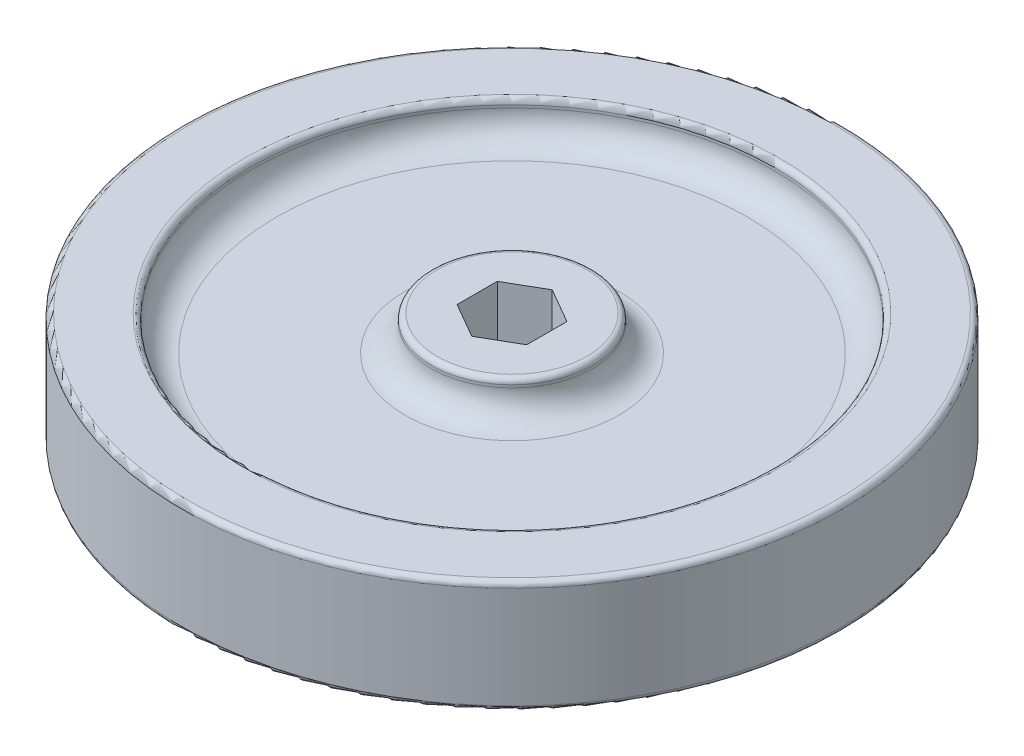
ISO-10303-21;
HEADER;
FILE_DESCRIPTION(('STEP AP214'),'2;1');
FILE_NAME('part.step','',(''),(''),'','','');
FILE_SCHEMA(('AUTOMOTIVE_DESIGN { 1 0 10303 214 1 1 1 1 }'));
ENDSEC;
DATA;
#1=APPLICATION_CONTEXT('core data for automotive mechanical design processes');
#2=APPLICATION_PROTOCOL_DEFINITION('international standard','automotive_design',2000,#1);
#3=PRODUCT_CONTEXT('',#1,'mechanical');
#4=PRODUCT('Part','Part','',(#3));
#5=PRODUCT_RELATED_PRODUCT_CATEGORY('part','',(#4));
#6=PRODUCT_DEFINITION_FORMATION('','',#4);
#7=PRODUCT_DEFINITION_CONTEXT('part definition',#1,'design');
#8=PRODUCT_DEFINITION('design','',#6,#7);
#9=PRODUCT_DEFINITION_SHAPE('','',#8);
#10=(LENGTH_UNIT() NAMED_UNIT(*) SI_UNIT(.MILLI.,.METRE.));
#11=(NAMED_UNIT(*) PLANE_ANGLE_UNIT() SI_UNIT($,.RADIAN.));
#12=(NAMED_UNIT(*) SI_UNIT($,.STERADIAN.) SOLID_ANGLE_UNIT());
#13=UNCERTAINTY_MEASURE_WITH_UNIT(LENGTH_MEASURE(1.E-05),#10,'distance_accuracy_value','');
#14=(GEOMETRIC_REPRESENTATION_CONTEXT(3) GLOBAL_UNCERTAINTY_ASSIGNED_CONTEXT((#13)) GLOBAL_UNIT_ASSIGNED_CONTEXT((#10,
#11,#12)) REPRESENTATION_CONTEXT('',''));
#15=CARTESIAN_POINT('',(0.,0.,0.));
#16=DIRECTION('',(0.,0.,1.));
#17=DIRECTION('',(1.,0.,0.));
#18=AXIS2_PLACEMENT_3D('',#15,#16,#17);
#19=CARTESIAN_POINT('',(0.,0.,0.));
#20=DIRECTION('',(0.,-1.,0.));
#21=DIRECTION('',(1.,0.,0.));
#22=AXIS2_PLACEMENT_3D('',#19,#20,#21);
#23=PLANE('',#22);
#24=CARTESIAN_POINT('',(0.,0.,0.));
#25=DIRECTION('',(0.,-1.,0.));
#26=DIRECTION('',(1.,0.,0.));
#27=AXIS2_PLACEMENT_3D('',#24,#25,#26);
#28=CIRCLE('',#27,13.9999999999999);
#29=CARTESIAN_POINT('',(13.9999999999999,0.,0.));
#30=VERTEX_POINT('',#29);
#31=EDGE_CURVE('E200',#30,#30,#28,.T.);
#32=ORIENTED_EDGE('',*,*,#31,.T.);
#33=EDGE_LOOP('',(#32));
#34=FACE_BOUND('',#33,.T.);
#35=DIRECTION('',(-0.866025403784439,0.,-0.5));
#36=VECTOR('',#35,1.);
#37=CARTESIAN_POINT('',(6.5,-2.42861286636753E-13,-3.75277674973257));
#38=LINE('',#37,#36);
#39=CARTESIAN_POINT('',(6.5,-2.42861286636753E-13,-3.75277674973257));
#40=VERTEX_POINT('',#39);
#41=CARTESIAN_POINT('',(0.,-2.63677968348475E-13,-7.50555349946514));
#42=VERTEX_POINT('',#41);
#43=EDGE_CURVE('E101',#40,#42,#38,.T.);
#44=ORIENTED_EDGE('',*,*,#43,.T.);
#45=DIRECTION('',(-0.866025403784439,0.,0.5));
#46=VECTOR('',#45,1.);
#47=CARTESIAN_POINT('',(0.,-2.63677968348475E-13,-7.50555349946514));
#48=LINE('',#47,#46);
#49=CARTESIAN_POINT('',(-6.50000000000007,0.,-3.75277674973252));
#50=VERTEX_POINT('',#49);
#51=EDGE_CURVE('E112',#42,#50,#48,.T.);
#52=ORIENTED_EDGE('',*,*,#51,.T.);
#53=DIRECTION('',(0.,0.,1.));
#54=VECTOR('',#53,1.);
#55=CARTESIAN_POINT('',(-6.5,-2.84494650060196E-13,-3.75277674973257));
#56=LINE('',#55,#54);
#57=CARTESIAN_POINT('',(-6.5,-2.84494650060196E-13,3.75277674973257));
#58=VERTEX_POINT('',#57);
#59=EDGE_CURVE('E63',#50,#58,#56,.T.);
#60=ORIENTED_EDGE('',*,*,#59,.T.);
#61=DIRECTION('',(0.866025403784439,0.,0.5));
#62=VECTOR('',#61,1.);
#63=CARTESIAN_POINT('',(-6.5,-2.84494650060196E-13,3.75277674973257));
#64=LINE('',#63,#62);
#65=CARTESIAN_POINT('',(0.,-2.63677968348475E-13,7.50555349946513));
#66=VERTEX_POINT('',#65);
#67=EDGE_CURVE('E126',#58,#66,#64,.T.);
#68=ORIENTED_EDGE('',*,*,#67,.T.);
#69=DIRECTION('',(0.866025403784439,0.,-0.5));
#70=VECTOR('',#69,1.);
#71=CARTESIAN_POINT('',(0.,-2.63677968348475E-13,7.50555349946513));
#72=LINE('',#71,#70);
#73=CARTESIAN_POINT('',(6.5,-2.42861286636753E-13,3.75277674973257));
#74=VERTEX_POINT('',#73);
#75=EDGE_CURVE('E135',#66,#74,#72,.T.);
#76=ORIENTED_EDGE('',*,*,#75,.T.);
#77=DIRECTION('',(0.,0.,-1.));
#78=VECTOR('',#77,1.);
#79=CARTESIAN_POINT('',(6.5,-2.42861286636753E-13,3.75277674973257));
#80=LINE('',#79,#78);
#81=EDGE_CURVE('E107',#74,#40,#80,.T.);
#82=ORIENTED_EDGE('',*,*,#81,.T.);
#83=EDGE_LOOP('',(#44,#52,#60,#68,#76,#82));
#84=FACE_BOUND('',#83,.T.);
#85=ADVANCED_FACE('F44',(#34,#84),#23,.T.);
#86=CARTESIAN_POINT('',(1.9035519623152E-12,-554.931132676819,0.));
#87=DIRECTION('',(0.,-1.,0.));
#88=DIRECTION('',(1.,0.,0.));
#89=AXIS2_PLACEMENT_3D('',#86,#87,#88);
#90=CYLINDRICAL_SURFACE('',#89,14.9999999999999);
#91=CARTESIAN_POINT('',(0.,1.49999999999995,0.));
#92=DIRECTION('',(0.,-1.,0.));
#93=DIRECTION('',(1.,0.,0.));
#94=AXIS2_PLACEMENT_3D('',#91,#92,#93);
#95=CIRCLE('',#94,14.9999999999999);
#96=CARTESIAN_POINT('',(14.9999999999999,1.5,0.));
#97=VERTEX_POINT('',#96);
#98=EDGE_CURVE('E230',#97,#97,#95,.T.);
#99=ORIENTED_EDGE('',*,*,#98,.T.);
#100=EDGE_LOOP('',(#99));
#101=FACE_BOUND('',#100,.T.);
#102=CARTESIAN_POINT('',(0.,1.,0.));
#103=DIRECTION('',(0.,-1.,0.));
#104=DIRECTION('',(1.,0.,0.));
#105=AXIS2_PLACEMENT_3D('',#102,#103,#104);
#106=CIRCLE('',#105,14.9999999999999);
#107=CARTESIAN_POINT('',(14.9999999999999,1.00000000000005,0.));
#108=VERTEX_POINT('',#107);
#109=EDGE_CURVE('E201',#108,#108,#106,.F.);
#110=ORIENTED_EDGE('',*,*,#109,.T.);
#111=EDGE_LOOP('',(#110));
#112=FACE_BOUND('',#111,.T.);
#113=ADVANCED_FACE('F289',(#101,#112),#90,.T.);
#114=CARTESIAN_POINT('',(14.9999999999999,6.49999999999994,0.));
#115=DIRECTION('',(0.,-1.,0.));
#116=DIRECTION('',(1.,0.,0.));
#117=AXIS2_PLACEMENT_3D('',#114,#115,#116);
#118=PLANE('',#117);
#119=CARTESIAN_POINT('',(0.,6.49999999999989,0.));
#120=DIRECTION('',(0.,-1.,0.));
#121=DIRECTION('',(1.,0.,0.));
#122=AXIS2_PLACEMENT_3D('',#119,#120,#121);
#123=CIRCLE('',#122,44.);
#124=CARTESIAN_POINT('',(44.,6.50000000000004,0.));
#125=VERTEX_POINT('',#124);
#126=EDGE_CURVE('E218',#125,#125,#123,.T.);
#127=ORIENTED_EDGE('',*,*,#126,.T.);
#128=EDGE_LOOP('',(#127));
#129=FACE_BOUND('',#128,.T.);
#130=CARTESIAN_POINT('',(0.,6.49999999999989,0.));
#131=DIRECTION('',(0.,-1.,0.));
#132=DIRECTION('',(1.,0.,0.));
#133=AXIS2_PLACEMENT_3D('',#130,#131,#132);
#134=CIRCLE('',#133,19.9999999999999);
#135=CARTESIAN_POINT('',(19.9999999999999,6.49999999999996,0.));
#136=VERTEX_POINT('',#135);
#137=EDGE_CURVE('E214',#136,#136,#134,.F.);
#138=ORIENTED_EDGE('',*,*,#137,.T.);
#139=EDGE_LOOP('',(#138));
#140=FACE_BOUND('',#139,.T.);
#141=ADVANCED_FACE('F300',(#129,#140),#118,.T.);
#142=CARTESIAN_POINT('',(1.9035519623152E-12,-554.931132676819,0.));
#143=DIRECTION('',(0.,-1.,0.));
#144=DIRECTION('',(1.,0.,0.));
#145=AXIS2_PLACEMENT_3D('',#142,#143,#144);
#146=CYLINDRICAL_SURFACE('',#145,49.);
#147=CARTESIAN_POINT('',(0.,1.49999999999995,0.));
#148=DIRECTION('',(0.,-1.,0.));
#149=DIRECTION('',(1.,0.,0.));
#150=AXIS2_PLACEMENT_3D('',#147,#148,#149);
#151=CIRCLE('',#150,49.);
#152=CARTESIAN_POINT('',(49.,1.50000000000011,0.));
#153=VERTEX_POINT('',#152);
#154=EDGE_CURVE('E224',#153,#153,#151,.F.);
#155=ORIENTED_EDGE('',*,*,#154,.T.);
#156=EDGE_LOOP('',(#155));
#157=FACE_BOUND('',#156,.T.);
#158=CARTESIAN_POINT('',(0.,0.999999999999779,0.));
#159=DIRECTION('',(0.,-1.,0.));
#160=DIRECTION('',(1.,0.,0.));
#161=AXIS2_PLACEMENT_3D('',#158,#159,#160);
#162=CIRCLE('',#161,49.);
#163=CARTESIAN_POINT('',(49.,0.999999999999947,0.));
#164=VERTEX_POINT('',#163);
#165=EDGE_CURVE('E177',#164,#164,#162,.T.);
#166=ORIENTED_EDGE('',*,*,#165,.T.);
#167=EDGE_LOOP('',(#166));
#168=FACE_BOUND('',#167,.T.);
#169=ADVANCED_FACE('F286',(#157,#168),#146,.F.);
#170=CARTESIAN_POINT('',(49.,0.,0.));
#171=DIRECTION('',(0.,-1.,0.));
#172=DIRECTION('',(1.,0.,0.));
#173=AXIS2_PLACEMENT_3D('',#170,#171,#172);
#174=PLANE('',#173);
#175=CARTESIAN_POINT('',(0.,-1.89518539750466E-13,0.));
#176=DIRECTION('',(0.,-1.,0.));
#177=DIRECTION('',(1.,0.,0.));
#178=AXIS2_PLACEMENT_3D('',#175,#176,#177);
#179=CIRCLE('',#178,50.);
#180=CARTESIAN_POINT('',(50.,0.,0.));
#181=VERTEX_POINT('',#180);
#182=EDGE_CURVE('E190',#181,#181,#179,.F.);
#183=ORIENTED_EDGE('',*,*,#182,.T.);
#184=EDGE_LOOP('',(#183));
#185=FACE_BOUND('',#184,.T.);
#186=CARTESIAN_POINT('',(0.,-1.89518539750466E-13,0.));
#187=DIRECTION('',(0.,-1.,0.));
#188=DIRECTION('',(1.,0.,0.));
#189=AXIS2_PLACEMENT_3D('',#186,#187,#188);
#190=CIRCLE('',#189,60.5);
#191=CARTESIAN_POINT('',(60.5,0.,0.));
#192=VERTEX_POINT('',#191);
#193=EDGE_CURVE('E181',#192,#192,#190,.T.);
#194=ORIENTED_EDGE('',*,*,#193,.T.);
#195=EDGE_LOOP('',(#194));
#196=FACE_BOUND('',#195,.T.);
#197=ADVANCED_FACE('F278',(#185,#196),#174,.T.);
#198=CARTESIAN_POINT('',(1.9035519623152E-12,-554.931132676819,0.));
#199=DIRECTION('',(0.,-1.,0.));
#200=DIRECTION('',(1.,0.,0.));
#201=AXIS2_PLACEMENT_3D('',#198,#199,#200);
#202=CYLINDRICAL_SURFACE('',#201,61.5);
#203=CARTESIAN_POINT('',(0.,0.999999999999779,0.));
#204=DIRECTION('',(0.,-1.,0.));
#205=DIRECTION('',(1.,0.,0.));
#206=AXIS2_PLACEMENT_3D('',#203,#204,#205);
#207=CIRCLE('',#206,61.5);
#208=CARTESIAN_POINT('',(61.5,0.99999999999999,0.));
#209=VERTEX_POINT('',#208);
#210=EDGE_CURVE('E194',#209,#209,#207,.F.);
#211=ORIENTED_EDGE('',*,*,#210,.T.);
#212=EDGE_LOOP('',(#211));
#213=FACE_BOUND('',#212,.T.);
#214=CARTESIAN_POINT('',(0.,19.9999999999998,0.));
#215=DIRECTION('',(0.,1.,0.));
#216=DIRECTION('',(-1.,0.,0.));
#217=AXIS2_PLACEMENT_3D('',#214,#215,#216);
#218=CIRCLE('',#217,61.5);
#219=CARTESIAN_POINT('',(-61.5000000000001,19.9999999999996,0.));
#220=VERTEX_POINT('',#219);
#221=EDGE_CURVE('E191',#220,#220,#218,.F.);
#222=ORIENTED_EDGE('',*,*,#221,.T.);
#223=EDGE_LOOP('',(#222));
#224=FACE_BOUND('',#223,.T.);
#225=ADVANCED_FACE('F270',(#213,#224),#202,.T.);
#226=CARTESIAN_POINT('',(61.5,21.,0.));
#227=DIRECTION('',(0.,1.,0.));
#228=DIRECTION('',(-1.,0.,0.));
#229=AXIS2_PLACEMENT_3D('',#226,#227,#228);
#230=PLANE('',#229);
#231=CARTESIAN_POINT('',(0.,20.9999999999998,0.));
#232=DIRECTION('',(0.,1.,0.));
#233=DIRECTION('',(-1.,0.,0.));
#234=AXIS2_PLACEMENT_3D('',#231,#232,#233);
#235=CIRCLE('',#234,50.0000000000001);
#236=CARTESIAN_POINT('',(-50.0000000000001,20.9999999999996,0.));
#237=VERTEX_POINT('',#236);
#238=EDGE_CURVE('E173',#237,#237,#235,.F.);
#239=ORIENTED_EDGE('',*,*,#238,.T.);
#240=EDGE_LOOP('',(#239));
#241=FACE_BOUND('',#240,.T.);
#242=CARTESIAN_POINT('',(0.,20.9999999999998,0.));
#243=DIRECTION('',(0.,1.,0.));
#244=DIRECTION('',(-1.,0.,0.));
#245=AXIS2_PLACEMENT_3D('',#242,#243,#244);
#246=CIRCLE('',#245,60.5);
#247=CARTESIAN_POINT('',(-60.5000000000001,20.9999999999996,0.));
#248=VERTEX_POINT('',#247);
#249=EDGE_CURVE('E156',#248,#248,#246,.T.);
#250=ORIENTED_EDGE('',*,*,#249,.T.);
#251=EDGE_LOOP('',(#250));
#252=FACE_BOUND('',#251,.T.);
#253=ADVANCED_FACE('F255',(#241,#252),#230,.T.);
#254=CARTESIAN_POINT('',(1.9035519623152E-12,-554.931132676819,0.));
#255=DIRECTION('',(0.,-1.,0.));
#256=DIRECTION('',(1.,0.,0.));
#257=AXIS2_PLACEMENT_3D('',#254,#255,#256);
#258=CYLINDRICAL_SURFACE('',#257,49.0000000000001);
#259=CARTESIAN_POINT('',(0.,19.4999999999997,0.));
#260=DIRECTION('',(0.,1.,0.));
#261=DIRECTION('',(-1.,0.,0.));
#262=AXIS2_PLACEMENT_3D('',#259,#260,#261);
#263=CIRCLE('',#262,49.0000000000001);
#264=CARTESIAN_POINT('',(-49.0000000000001,19.4999999999996,0.));
#265=VERTEX_POINT('',#264);
#266=EDGE_CURVE('E231',#265,#265,#263,.F.);
#267=ORIENTED_EDGE('',*,*,#266,.T.);
#268=EDGE_LOOP('',(#267));
#269=FACE_BOUND('',#268,.T.);
#270=CARTESIAN_POINT('',(0.,19.9999999999997,0.));
#271=DIRECTION('',(0.,1.,0.));
#272=DIRECTION('',(-1.,0.,0.));
#273=AXIS2_PLACEMENT_3D('',#270,#271,#272);
#274=CIRCLE('',#273,49.0000000000001);
#275=CARTESIAN_POINT('',(-49.0000000000001,19.9999999999995,0.));
#276=VERTEX_POINT('',#275);
#277=EDGE_CURVE('E172',#276,#276,#274,.T.);
#278=ORIENTED_EDGE('',*,*,#277,.T.);
#279=EDGE_LOOP('',(#278));
#280=FACE_BOUND('',#279,.T.);
#281=ADVANCED_FACE('F253',(#269,#280),#258,.F.);
#282=CARTESIAN_POINT('',(49.,14.5000000000001,0.));
#283=DIRECTION('',(0.,1.,0.));
#284=DIRECTION('',(-1.,0.,0.));
#285=AXIS2_PLACEMENT_3D('',#282,#283,#284);
#286=PLANE('',#285);
#287=CARTESIAN_POINT('',(0.,14.4999999999999,0.));
#288=DIRECTION('',(0.,1.,0.));
#289=DIRECTION('',(-1.,0.,0.));
#290=AXIS2_PLACEMENT_3D('',#287,#288,#289);
#291=CIRCLE('',#290,44.0000000000001);
#292=CARTESIAN_POINT('',(-44.0000000000001,14.4999999999997,0.));
#293=VERTEX_POINT('',#292);
#294=EDGE_CURVE('E53',#293,#293,#291,.T.);
#295=ORIENTED_EDGE('',*,*,#294,.T.);
#296=EDGE_LOOP('',(#295));
#297=FACE_BOUND('',#296,.T.);
#298=CARTESIAN_POINT('',(0.,14.4999999999999,0.));
#299=DIRECTION('',(0.,1.,0.));
#300=DIRECTION('',(-1.,0.,0.));
#301=AXIS2_PLACEMENT_3D('',#298,#299,#300);
#302=CIRCLE('',#301,20.0000000000001);
#303=CARTESIAN_POINT('',(-20.0000000000001,14.4999999999998,0.));
#304=VERTEX_POINT('',#303);
#305=EDGE_CURVE('E234',#304,#304,#302,.F.);
#306=ORIENTED_EDGE('',*,*,#305,.T.);
#307=EDGE_LOOP('',(#306));
#308=FACE_BOUND('',#307,.T.);
#309=ADVANCED_FACE('F245',(#297,#308),#286,.T.);
#310=CARTESIAN_POINT('',(1.9035519623152E-12,-554.931132676819,0.));
#311=DIRECTION('',(0.,-1.,0.));
#312=DIRECTION('',(1.,0.,0.));
#313=AXIS2_PLACEMENT_3D('',#310,#311,#312);
#314=CYLINDRICAL_SURFACE('',#313,15.0000000000001);
#315=CARTESIAN_POINT('',(0.,19.4999999999999,0.));
#316=DIRECTION('',(0.,1.,0.));
#317=DIRECTION('',(-1.,0.,0.));
#318=AXIS2_PLACEMENT_3D('',#315,#316,#317);
#319=CIRCLE('',#318,15.0000000000001);
#320=CARTESIAN_POINT('',(-15.0000000000001,19.4999999999998,0.));
#321=VERTEX_POINT('',#320);
#322=EDGE_CURVE('E11',#321,#321,#319,.T.);
#323=ORIENTED_EDGE('',*,*,#322,.T.);
#324=EDGE_LOOP('',(#323));
#325=FACE_BOUND('',#324,.T.);
#326=CARTESIAN_POINT('',(0.,20.,0.));
#327=DIRECTION('',(0.,1.,0.));
#328=DIRECTION('',(-1.,0.,0.));
#329=AXIS2_PLACEMENT_3D('',#326,#327,#328);
#330=CIRCLE('',#329,15.0000000000001);
#331=CARTESIAN_POINT('',(-15.0000000000001,20.,0.));
#332=VERTEX_POINT('',#331);
#333=EDGE_CURVE('E210',#332,#332,#330,.F.);
#334=ORIENTED_EDGE('',*,*,#333,.T.);
#335=EDGE_LOOP('',(#334));
#336=FACE_BOUND('',#335,.T.);
#337=ADVANCED_FACE('F359',(#325,#336),#314,.T.);
#338=CARTESIAN_POINT('',(15.,21.,0.));
#339=DIRECTION('',(0.,1.,0.));
#340=DIRECTION('',(-1.,0.,0.));
#341=AXIS2_PLACEMENT_3D('',#338,#339,#340);
#342=PLANE('',#341);
#343=CARTESIAN_POINT('',(0.,21.,0.));
#344=DIRECTION('',(0.,1.,0.));
#345=DIRECTION('',(-1.,0.,0.));
#346=AXIS2_PLACEMENT_3D('',#343,#344,#345);
#347=CIRCLE('',#346,14.0000000000001);
#348=CARTESIAN_POINT('',(-14.0000000000001,20.9999999999999,0.));
#349=VERTEX_POINT('',#348);
#350=EDGE_CURVE('E211',#349,#349,#347,.T.);
#351=ORIENTED_EDGE('',*,*,#350,.T.);
#352=EDGE_LOOP('',(#351));
#353=FACE_BOUND('',#352,.T.);
#354=DIRECTION('',(-0.866025403784439,0.,-0.5));
#355=VECTOR('',#354,1.);
#356=CARTESIAN_POINT('',(6.49999999999993,21.,-3.75277674973257));
#357=LINE('',#356,#355);
#358=CARTESIAN_POINT('',(6.49999999999993,21.,-3.75277674973257));
#359=VERTEX_POINT('',#358);
#360=CARTESIAN_POINT('',(0.,21.,-7.50555349946518));
#361=VERTEX_POINT('',#360);
#362=EDGE_CURVE('E67',#359,#361,#357,.T.);
#363=ORIENTED_EDGE('',*,*,#362,.F.);
#364=DIRECTION('',(0.,0.,-1.));
#365=VECTOR('',#364,1.);
#366=CARTESIAN_POINT('',(6.49999999999993,21.,3.75277674973257));
#367=LINE('',#366,#365);
#368=CARTESIAN_POINT('',(6.49999999999993,21.,3.75277674973257));
#369=VERTEX_POINT('',#368);
#370=EDGE_CURVE('E119',#369,#359,#367,.T.);
#371=ORIENTED_EDGE('',*,*,#370,.F.);
#372=DIRECTION('',(0.866025403784439,0.,-0.5));
#373=VECTOR('',#372,1.);
#374=CARTESIAN_POINT('',(0.,21.,7.50555349946513));
#375=LINE('',#374,#373);
#376=CARTESIAN_POINT('',(0.,21.,7.50555349946513));
#377=VERTEX_POINT('',#376);
#378=EDGE_CURVE('E123',#377,#369,#375,.T.);
#379=ORIENTED_EDGE('',*,*,#378,.F.);
#380=DIRECTION('',(0.866025403784439,0.,0.5));
#381=VECTOR('',#380,1.);
#382=CARTESIAN_POINT('',(-6.50000000000007,21.,3.75277674973257));
#383=LINE('',#382,#381);
#384=CARTESIAN_POINT('',(-6.50000000000007,21.,3.75277674973257));
#385=VERTEX_POINT('',#384);
#386=EDGE_CURVE('E148',#385,#377,#383,.T.);
#387=ORIENTED_EDGE('',*,*,#386,.F.);
#388=DIRECTION('',(0.,0.,1.));
#389=VECTOR('',#388,1.);
#390=CARTESIAN_POINT('',(-6.50000000000007,21.,-3.75277674973257));
#391=LINE('',#390,#389);
#392=CARTESIAN_POINT('',(-6.50000000000007,21.,-3.75277674973257));
#393=VERTEX_POINT('',#392);
#394=EDGE_CURVE('E142',#393,#385,#391,.T.);
#395=ORIENTED_EDGE('',*,*,#394,.F.);
#396=DIRECTION('',(-0.866025403784439,0.,0.5));
#397=VECTOR('',#396,1.);
#398=CARTESIAN_POINT('',(0.,21.,-7.50555349946514));
#399=LINE('',#398,#397);
#400=EDGE_CURVE('E137',#361,#393,#399,.T.);
#401=ORIENTED_EDGE('',*,*,#400,.F.);
#402=EDGE_LOOP('',(#363,#371,#379,#387,#395,#401));
#403=FACE_BOUND('',#402,.T.);
#404=ADVANCED_FACE('F370',(#353,#403),#342,.T.);
#405=CARTESIAN_POINT('',(6.5,-2.42861286636753E-13,-3.75277674973257));
#406=DIRECTION('',(0.5,0.,-0.866025403784439));
#407=DIRECTION('',(-0.866025403784439,0.,-0.5));
#408=AXIS2_PLACEMENT_3D('',#405,#406,#407);
#409=PLANE('',#408);
#410=ORIENTED_EDGE('',*,*,#362,.T.);
#411=DIRECTION('',(0.,1.,0.));
#412=VECTOR('',#411,1.);
#413=CARTESIAN_POINT('',(0.,-2.63677968348475E-13,-7.50555349946514));
#414=LINE('',#413,#412);
#415=EDGE_CURVE('E100',#42,#361,#414,.T.);
#416=ORIENTED_EDGE('',*,*,#415,.F.);
#417=ORIENTED_EDGE('',*,*,#43,.F.);
#418=DIRECTION('',(0.,1.,0.));
#419=VECTOR('',#418,1.);
#420=CARTESIAN_POINT('',(6.5,-2.42861286636753E-13,-3.75277674973257));
#421=LINE('',#420,#419);
#422=EDGE_CURVE('E153',#40,#359,#421,.T.);
#423=ORIENTED_EDGE('',*,*,#422,.T.);
#424=EDGE_LOOP('',(#410,#416,#417,#423));
#425=FACE_BOUND('',#424,.T.);
#426=ADVANCED_FACE('F97',(#425),#409,.F.);
#427=CARTESIAN_POINT('',(6.5,-2.42861286636753E-13,3.75277674973257));
#428=DIRECTION('',(1.,0.,0.));
#429=DIRECTION('',(0.,1.,0.));
#430=AXIS2_PLACEMENT_3D('',#427,#428,#429);
#431=PLANE('',#430);
#432=ORIENTED_EDGE('',*,*,#370,.T.);
#433=ORIENTED_EDGE('',*,*,#422,.F.);
#434=ORIENTED_EDGE('',*,*,#81,.F.);
#435=DIRECTION('',(0.,1.,0.));
#436=VECTOR('',#435,1.);
#437=CARTESIAN_POINT('',(6.5,-2.42861286636753E-13,3.75277674973257));
#438=LINE('',#437,#436);
#439=EDGE_CURVE('E160',#74,#369,#438,.T.);
#440=ORIENTED_EDGE('',*,*,#439,.T.);
#441=EDGE_LOOP('',(#432,#433,#434,#440));
#442=FACE_BOUND('',#441,.T.);
#443=ADVANCED_FACE('F475',(#442),#431,.F.);
#444=CARTESIAN_POINT('',(0.,-2.63677968348475E-13,7.50555349946513));
#445=DIRECTION('',(0.5,0.,0.866025403784439));
#446=DIRECTION('',(0.866025403784439,0.,-0.5));
#447=AXIS2_PLACEMENT_3D('',#444,#445,#446);
#448=PLANE('',#447);
#449=ORIENTED_EDGE('',*,*,#378,.T.);
#450=ORIENTED_EDGE('',*,*,#439,.F.);
#451=ORIENTED_EDGE('',*,*,#75,.F.);
#452=DIRECTION('',(0.,1.,0.));
#453=VECTOR('',#452,1.);
#454=CARTESIAN_POINT('',(0.,-2.63677968348475E-13,7.50555349946513));
#455=LINE('',#454,#453);
#456=EDGE_CURVE('E159',#66,#377,#455,.T.);
#457=ORIENTED_EDGE('',*,*,#456,.T.);
#458=EDGE_LOOP('',(#449,#450,#451,#457));
#459=FACE_BOUND('',#458,.T.);
#460=ADVANCED_FACE('F464',(#459),#448,.F.);
#461=CARTESIAN_POINT('',(-6.5,-2.84494650060196E-13,3.75277674973257));
#462=DIRECTION('',(-0.5,0.,0.866025403784439));
#463=DIRECTION('',(0.866025403784439,0.,0.5));
#464=AXIS2_PLACEMENT_3D('',#461,#462,#463);
#465=PLANE('',#464);
#466=ORIENTED_EDGE('',*,*,#386,.T.);
#467=ORIENTED_EDGE('',*,*,#456,.F.);
#468=ORIENTED_EDGE('',*,*,#67,.F.);
#469=DIRECTION('',(0.,1.,0.));
#470=VECTOR('',#469,1.);
#471=CARTESIAN_POINT('',(-6.5,-2.84494650060196E-13,3.75277674973257));
#472=LINE('',#471,#470);
#473=EDGE_CURVE('E162',#58,#385,#472,.T.);
#474=ORIENTED_EDGE('',*,*,#473,.T.);
#475=EDGE_LOOP('',(#466,#467,#468,#474));
#476=FACE_BOUND('',#475,.T.);
#477=ADVANCED_FACE('F454',(#476),#465,.F.);
#478=CARTESIAN_POINT('',(-6.5,-2.84494650060196E-13,-3.75277674973257));
#479=DIRECTION('',(-1.,0.,0.));
#480=DIRECTION('',(0.,-1.,0.));
#481=AXIS2_PLACEMENT_3D('',#478,#479,#480);
#482=PLANE('',#481);
#483=ORIENTED_EDGE('',*,*,#394,.T.);
#484=ORIENTED_EDGE('',*,*,#473,.F.);
#485=ORIENTED_EDGE('',*,*,#59,.F.);
#486=DIRECTION('',(0.,1.,0.));
#487=VECTOR('',#486,1.);
#488=CARTESIAN_POINT('',(-6.5,-2.84494650060196E-13,-3.75277674973257));
#489=LINE('',#488,#487);
#490=EDGE_CURVE('E110',#50,#393,#489,.T.);
#491=ORIENTED_EDGE('',*,*,#490,.T.);
#492=EDGE_LOOP('',(#483,#484,#485,#491));
#493=FACE_BOUND('',#492,.T.);
#494=ADVANCED_FACE('F448',(#493),#482,.F.);
#495=CARTESIAN_POINT('',(0.,-2.63677968348475E-13,-7.50555349946514));
#496=DIRECTION('',(-0.5,0.,-0.866025403784438));
#497=DIRECTION('',(-0.866025403784439,0.,0.5));
#498=AXIS2_PLACEMENT_3D('',#495,#496,#497);
#499=PLANE('',#498);
#500=ORIENTED_EDGE('',*,*,#400,.T.);
#501=ORIENTED_EDGE('',*,*,#490,.F.);
#502=ORIENTED_EDGE('',*,*,#51,.F.);
#503=ORIENTED_EDGE('',*,*,#415,.T.);
#504=EDGE_LOOP('',(#500,#501,#502,#503));
#505=FACE_BOUND('',#504,.T.);
#506=ADVANCED_FACE('F115',(#505),#499,.F.);
#507=CARTESIAN_POINT('',(0.,19.9999999999998,0.));
#508=DIRECTION('',(0.,1.,0.));
#509=DIRECTION('',(-1.,0.,0.));
#510=AXIS2_PLACEMENT_3D('',#507,#508,#509);
#511=TOROIDAL_SURFACE('',#510,50.0000000000001,1.);
#512=ORIENTED_EDGE('',*,*,#277,.F.);
#513=EDGE_LOOP('',(#512));
#514=FACE_BOUND('',#513,.T.);
#515=ORIENTED_EDGE('',*,*,#238,.F.);
#516=EDGE_LOOP('',(#515));
#517=FACE_BOUND('',#516,.T.);
#518=ADVANCED_FACE('F256',(#514,#517),#511,.T.);
#519=CARTESIAN_POINT('',(0.,0.999999999999779,0.));
#520=DIRECTION('',(0.,-1.,0.));
#521=DIRECTION('',(1.,0.,0.));
#522=AXIS2_PLACEMENT_3D('',#519,#520,#521);
#523=TOROIDAL_SURFACE('',#522,50.,1.);
#524=ORIENTED_EDGE('',*,*,#182,.F.);
#525=EDGE_LOOP('',(#524));
#526=FACE_BOUND('',#525,.T.);
#527=ORIENTED_EDGE('',*,*,#165,.F.);
#528=EDGE_LOOP('',(#527));
#529=FACE_BOUND('',#528,.T.);
#530=ADVANCED_FACE('F261',(#526,#529),#523,.T.);
#531=CARTESIAN_POINT('',(0.,0.999999999999779,0.));
#532=DIRECTION('',(0.,-1.,0.));
#533=DIRECTION('',(1.,0.,0.));
#534=AXIS2_PLACEMENT_3D('',#531,#532,#533);
#535=TOROIDAL_SURFACE('',#534,60.5,1.);
#536=ORIENTED_EDGE('',*,*,#210,.F.);
#537=EDGE_LOOP('',(#536));
#538=FACE_BOUND('',#537,.T.);
#539=ORIENTED_EDGE('',*,*,#193,.F.);
#540=EDGE_LOOP('',(#539));
#541=FACE_BOUND('',#540,.T.);
#542=ADVANCED_FACE('F274',(#538,#541),#535,.T.);
#543=CARTESIAN_POINT('',(0.,19.9999999999998,0.));
#544=DIRECTION('',(0.,1.,0.));
#545=DIRECTION('',(-1.,0.,0.));
#546=AXIS2_PLACEMENT_3D('',#543,#544,#545);
#547=TOROIDAL_SURFACE('',#546,60.5,1.);
#548=ORIENTED_EDGE('',*,*,#249,.F.);
#549=EDGE_LOOP('',(#548));
#550=FACE_BOUND('',#549,.T.);
#551=ORIENTED_EDGE('',*,*,#221,.F.);
#552=EDGE_LOOP('',(#551));
#553=FACE_BOUND('',#552,.T.);
#554=ADVANCED_FACE('F271',(#550,#553),#547,.T.);
#555=CARTESIAN_POINT('',(0.,1.,0.));
#556=DIRECTION('',(0.,-1.,0.));
#557=DIRECTION('',(1.,0.,0.));
#558=AXIS2_PLACEMENT_3D('',#555,#556,#557);
#559=TOROIDAL_SURFACE('',#558,13.9999999999999,1.);
#560=ORIENTED_EDGE('',*,*,#109,.F.);
#561=EDGE_LOOP('',(#560));
#562=FACE_BOUND('',#561,.T.);
#563=ORIENTED_EDGE('',*,*,#31,.F.);
#564=EDGE_LOOP('',(#563));
#565=FACE_BOUND('',#564,.T.);
#566=ADVANCED_FACE('F273',(#562,#565),#559,.T.);
#567=CARTESIAN_POINT('',(0.,20.,0.));
#568=DIRECTION('',(0.,1.,0.));
#569=DIRECTION('',(-1.,0.,0.));
#570=AXIS2_PLACEMENT_3D('',#567,#568,#569);
#571=TOROIDAL_SURFACE('',#570,14.0000000000001,1.);
#572=ORIENTED_EDGE('',*,*,#350,.F.);
#573=EDGE_LOOP('',(#572));
#574=FACE_BOUND('',#573,.T.);
#575=ORIENTED_EDGE('',*,*,#333,.F.);
#576=EDGE_LOOP('',(#575));
#577=FACE_BOUND('',#576,.T.);
#578=ADVANCED_FACE('F309',(#574,#577),#571,.T.);
#579=CARTESIAN_POINT('',(0.,1.49999999999995,0.));
#580=DIRECTION('',(0.,-1.,0.));
#581=DIRECTION('',(1.,0.,0.));
#582=AXIS2_PLACEMENT_3D('',#579,#580,#581);
#583=TOROIDAL_SURFACE('',#582,44.,5.);
#584=ORIENTED_EDGE('',*,*,#154,.F.);
#585=EDGE_LOOP('',(#584));
#586=FACE_BOUND('',#585,.T.);
#587=ORIENTED_EDGE('',*,*,#126,.F.);
#588=EDGE_LOOP('',(#587));
#589=FACE_BOUND('',#588,.T.);
#590=ADVANCED_FACE('F314',(#586,#589),#583,.F.);
#591=CARTESIAN_POINT('',(0.,1.49999999999995,0.));
#592=DIRECTION('',(0.,-1.,0.));
#593=DIRECTION('',(1.,0.,0.));
#594=AXIS2_PLACEMENT_3D('',#591,#592,#593);
#595=TOROIDAL_SURFACE('',#594,19.9999999999999,5.);
#596=ORIENTED_EDGE('',*,*,#137,.F.);
#597=EDGE_LOOP('',(#596));
#598=FACE_BOUND('',#597,.T.);
#599=ORIENTED_EDGE('',*,*,#98,.F.);
#600=EDGE_LOOP('',(#599));
#601=FACE_BOUND('',#600,.T.);
#602=ADVANCED_FACE('F248',(#598,#601),#595,.F.);
#603=CARTESIAN_POINT('',(0.,19.4999999999999,0.));
#604=DIRECTION('',(0.,1.,0.));
#605=DIRECTION('',(-1.,0.,0.));
#606=AXIS2_PLACEMENT_3D('',#603,#604,#605);
#607=TOROIDAL_SURFACE('',#606,44.0000000000001,5.);
#608=ORIENTED_EDGE('',*,*,#294,.F.);
#609=EDGE_LOOP('',(#608));
#610=FACE_BOUND('',#609,.T.);
#611=ORIENTED_EDGE('',*,*,#266,.F.);
#612=EDGE_LOOP('',(#611));
#613=FACE_BOUND('',#612,.T.);
#614=ADVANCED_FACE('F242',(#610,#613),#607,.F.);
#615=CARTESIAN_POINT('',(0.,19.4999999999999,0.));
#616=DIRECTION('',(0.,1.,0.));
#617=DIRECTION('',(-1.,0.,0.));
#618=AXIS2_PLACEMENT_3D('',#615,#616,#617);
#619=TOROIDAL_SURFACE('',#618,20.0000000000001,5.);
#620=ORIENTED_EDGE('',*,*,#322,.F.);
#621=EDGE_LOOP('',(#620));
#622=FACE_BOUND('',#621,.T.);
#623=ORIENTED_EDGE('',*,*,#305,.F.);
#624=EDGE_LOOP('',(#623));
#625=FACE_BOUND('',#624,.T.);
#626=ADVANCED_FACE('F50',(#622,#625),#619,.F.);
#627=CLOSED_SHELL('',(#85,#113,#141,#169,#197,#225,#253,#281,#309,#337,#404,#426,#443,#460,#477,
#494,#506,#518,#530,#542,#554,#566,#578,#590,#602,#614,#626));
#628=MANIFOLD_SOLID_BREP('B2',#627);
#629=ADVANCED_BREP_SHAPE_REPRESENTATION('',(#18,#628),#14);
#630=SHAPE_DEFINITION_REPRESENTATION(#9,#629);
ENDSEC;
END-ISO-10303-21;
